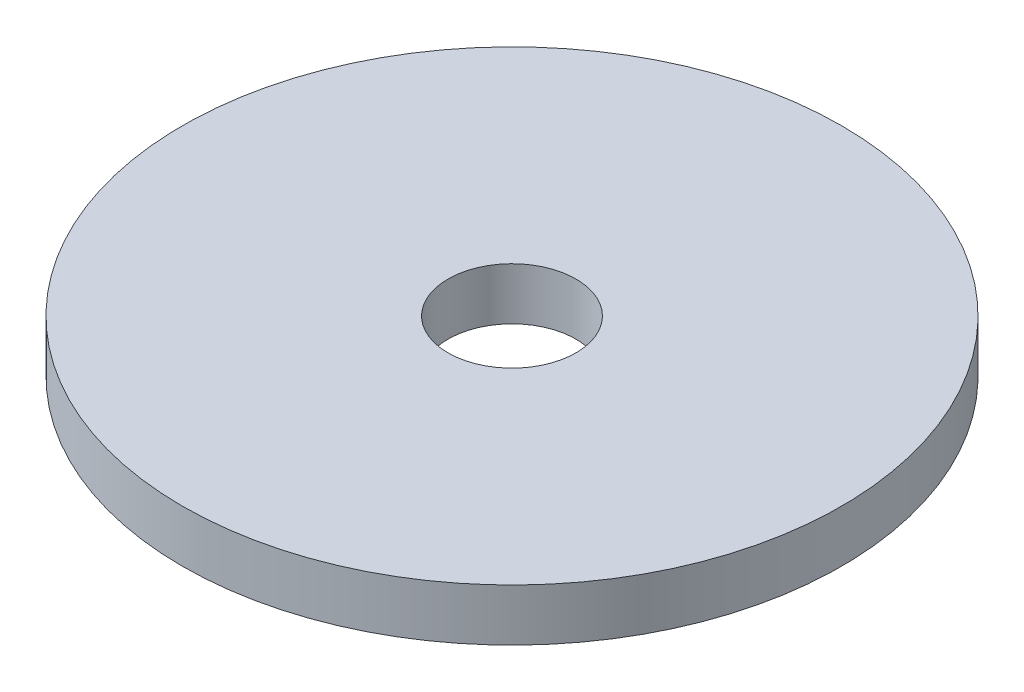
ISO-10303-21;
HEADER;
FILE_DESCRIPTION(('STEP AP214'),'2;1');
FILE_NAME('part.step','',(''),(''),'','','');
FILE_SCHEMA(('AUTOMOTIVE_DESIGN { 1 0 10303 214 1 1 1 1 }'));
ENDSEC;
DATA;
#1=APPLICATION_CONTEXT('core data for automotive mechanical design processes');
#2=APPLICATION_PROTOCOL_DEFINITION('international standard','automotive_design',2000,#1);
#3=PRODUCT_CONTEXT('',#1,'mechanical');
#4=PRODUCT('Part','Part','',(#3));
#5=PRODUCT_RELATED_PRODUCT_CATEGORY('part','',(#4));
#6=PRODUCT_DEFINITION_FORMATION('','',#4);
#7=PRODUCT_DEFINITION_CONTEXT('part definition',#1,'design');
#8=PRODUCT_DEFINITION('design','',#6,#7);
#9=PRODUCT_DEFINITION_SHAPE('','',#8);
#10=(LENGTH_UNIT() NAMED_UNIT(*) SI_UNIT(.MILLI.,.METRE.));
#11=(NAMED_UNIT(*) PLANE_ANGLE_UNIT() SI_UNIT($,.RADIAN.));
#12=(NAMED_UNIT(*) SI_UNIT($,.STERADIAN.) SOLID_ANGLE_UNIT());
#13=UNCERTAINTY_MEASURE_WITH_UNIT(LENGTH_MEASURE(1.E-05),#10,'distance_accuracy_value','');
#14=(GEOMETRIC_REPRESENTATION_CONTEXT(3) GLOBAL_UNCERTAINTY_ASSIGNED_CONTEXT((#13)) GLOBAL_UNIT_ASSIGNED_CONTEXT((#10,
#11,#12)) REPRESENTATION_CONTEXT('',''));
#15=CARTESIAN_POINT('',(0.,0.,0.));
#16=DIRECTION('',(0.,0.,1.));
#17=DIRECTION('',(1.,0.,0.));
#18=AXIS2_PLACEMENT_3D('',#15,#16,#17);
#19=CARTESIAN_POINT('',(0.,2.75,0.));
#20=DIRECTION('',(0.,1.,0.));
#21=DIRECTION('',(0.,0.,1.));
#22=AXIS2_PLACEMENT_3D('',#19,#20,#21);
#23=PLANE('',#22);
#24=CARTESIAN_POINT('',(0.,2.75,0.));
#25=DIRECTION('',(0.,1.,0.));
#26=DIRECTION('',(0.,0.,1.));
#27=AXIS2_PLACEMENT_3D('',#24,#25,#26);
#28=CIRCLE('',#27,17.4);
#29=CARTESIAN_POINT('',(0.,2.75,17.4));
#30=VERTEX_POINT('',#29);
#31=EDGE_CURVE('E10',#30,#30,#28,.T.);
#32=ORIENTED_EDGE('',*,*,#31,.T.);
#33=EDGE_LOOP('',(#32));
#34=FACE_BOUND('',#33,.T.);
#35=CARTESIAN_POINT('',(0.,2.75,0.));
#36=DIRECTION('',(0.,1.,0.));
#37=DIRECTION('',(0.,0.,1.));
#38=AXIS2_PLACEMENT_3D('',#35,#36,#37);
#39=CIRCLE('',#38,3.3782);
#40=CARTESIAN_POINT('',(0.,2.75,3.3782));
#41=VERTEX_POINT('',#40);
#42=EDGE_CURVE('E50',#41,#41,#39,.T.);
#43=ORIENTED_EDGE('',*,*,#42,.F.);
#44=EDGE_LOOP('',(#43));
#45=FACE_BOUND('',#44,.T.);
#46=ADVANCED_FACE('F37',(#34,#45),#23,.T.);
#47=CARTESIAN_POINT('',(0.,0.,0.));
#48=DIRECTION('',(0.,1.,0.));
#49=DIRECTION('',(0.,0.,1.));
#50=AXIS2_PLACEMENT_3D('',#47,#48,#49);
#51=PLANE('',#50);
#52=CARTESIAN_POINT('',(0.,0.,0.));
#53=DIRECTION('',(0.,1.,0.));
#54=DIRECTION('',(0.,0.,1.));
#55=AXIS2_PLACEMENT_3D('',#52,#53,#54);
#56=CIRCLE('',#55,17.4);
#57=CARTESIAN_POINT('',(0.,0.,17.4));
#58=VERTEX_POINT('',#57);
#59=EDGE_CURVE('E41',#58,#58,#56,.T.);
#60=ORIENTED_EDGE('',*,*,#59,.F.);
#61=EDGE_LOOP('',(#60));
#62=FACE_BOUND('',#61,.T.);
#63=CARTESIAN_POINT('',(0.,0.,0.));
#64=DIRECTION('',(0.,1.,0.));
#65=DIRECTION('',(0.,0.,1.));
#66=AXIS2_PLACEMENT_3D('',#63,#64,#65);
#67=CIRCLE('',#66,3.3782);
#68=CARTESIAN_POINT('',(0.,0.,3.3782));
#69=VERTEX_POINT('',#68);
#70=EDGE_CURVE('E52',#69,#69,#67,.T.);
#71=ORIENTED_EDGE('',*,*,#70,.T.);
#72=EDGE_LOOP('',(#71));
#73=FACE_BOUND('',#72,.T.);
#74=ADVANCED_FACE('F64',(#62,#73),#51,.F.);
#75=CARTESIAN_POINT('',(0.,2.75,0.));
#76=DIRECTION('',(0.,-1.,0.));
#77=DIRECTION('',(0.,0.,-1.));
#78=AXIS2_PLACEMENT_3D('',#75,#76,#77);
#79=CYLINDRICAL_SURFACE('',#78,17.4);
#80=ORIENTED_EDGE('',*,*,#31,.F.);
#81=EDGE_LOOP('',(#80));
#82=FACE_BOUND('',#81,.T.);
#83=ORIENTED_EDGE('',*,*,#59,.T.);
#84=EDGE_LOOP('',(#83));
#85=FACE_BOUND('',#84,.T.);
#86=ADVANCED_FACE('F39',(#82,#85),#79,.T.);
#87=CARTESIAN_POINT('',(0.,2.75,0.));
#88=DIRECTION('',(0.,-1.,0.));
#89=DIRECTION('',(0.,0.,-1.));
#90=AXIS2_PLACEMENT_3D('',#87,#88,#89);
#91=CYLINDRICAL_SURFACE('',#90,3.3782);
#92=ORIENTED_EDGE('',*,*,#42,.T.);
#93=EDGE_LOOP('',(#92));
#94=FACE_BOUND('',#93,.T.);
#95=ORIENTED_EDGE('',*,*,#70,.F.);
#96=EDGE_LOOP('',(#95));
#97=FACE_BOUND('',#96,.T.);
#98=ADVANCED_FACE('F60',(#94,#97),#91,.F.);
#99=CLOSED_SHELL('',(#46,#74,#86,#98));
#100=MANIFOLD_SOLID_BREP('B2',#99);
#101=ADVANCED_BREP_SHAPE_REPRESENTATION('',(#18,#100),#14);
#102=SHAPE_DEFINITION_REPRESENTATION(#9,#101);
ENDSEC;
END-ISO-10303-21;
